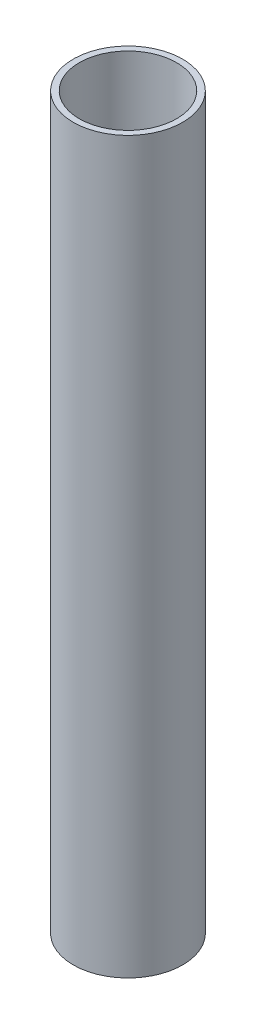
ISO-10303-21;
HEADER;
FILE_DESCRIPTION(('STEP AP214'),'2;1');
FILE_NAME('part.step','',(''),(''),'','','');
FILE_SCHEMA(('AUTOMOTIVE_DESIGN { 1 0 10303 214 1 1 1 1 }'));
ENDSEC;
DATA;
#1=APPLICATION_CONTEXT('core data for automotive mechanical design processes');
#2=APPLICATION_PROTOCOL_DEFINITION('international standard','automotive_design',2000,#1);
#3=PRODUCT_CONTEXT('',#1,'mechanical');
#4=PRODUCT('Part','Part','',(#3));
#5=PRODUCT_RELATED_PRODUCT_CATEGORY('part','',(#4));
#6=PRODUCT_DEFINITION_FORMATION('','',#4);
#7=PRODUCT_DEFINITION_CONTEXT('part definition',#1,'design');
#8=PRODUCT_DEFINITION('design','',#6,#7);
#9=PRODUCT_DEFINITION_SHAPE('','',#8);
#10=(LENGTH_UNIT() NAMED_UNIT(*) SI_UNIT(.MILLI.,.METRE.));
#11=(NAMED_UNIT(*) PLANE_ANGLE_UNIT() SI_UNIT($,.RADIAN.));
#12=(NAMED_UNIT(*) SI_UNIT($,.STERADIAN.) SOLID_ANGLE_UNIT());
#13=UNCERTAINTY_MEASURE_WITH_UNIT(LENGTH_MEASURE(1.E-05),#10,'distance_accuracy_value','');
#14=(GEOMETRIC_REPRESENTATION_CONTEXT(3) GLOBAL_UNCERTAINTY_ASSIGNED_CONTEXT((#13)) GLOBAL_UNIT_ASSIGNED_CONTEXT((#10,
#11,#12)) REPRESENTATION_CONTEXT('',''));
#15=CARTESIAN_POINT('',(0.,0.,0.));
#16=DIRECTION('',(0.,0.,1.));
#17=DIRECTION('',(1.,0.,0.));
#18=AXIS2_PLACEMENT_3D('',#15,#16,#17);
#19=CARTESIAN_POINT('',(0.,120.,0.));
#20=DIRECTION('',(0.,1.,0.));
#21=DIRECTION('',(0.,0.,1.));
#22=AXIS2_PLACEMENT_3D('',#19,#20,#21);
#23=PLANE('',#22);
#24=CARTESIAN_POINT('',(0.,120.,0.));
#25=DIRECTION('',(0.,1.,0.));
#26=DIRECTION('',(0.,0.,1.));
#27=AXIS2_PLACEMENT_3D('',#24,#25,#26);
#28=CIRCLE('',#27,9.);
#29=CARTESIAN_POINT('',(0.,120.,9.));
#30=VERTEX_POINT('',#29);
#31=EDGE_CURVE('E10',#30,#30,#28,.T.);
#32=ORIENTED_EDGE('',*,*,#31,.T.);
#33=EDGE_LOOP('',(#32));
#34=FACE_BOUND('',#33,.T.);
#35=CARTESIAN_POINT('',(0.,120.,0.));
#36=DIRECTION('',(0.,1.,0.));
#37=DIRECTION('',(0.,0.,1.));
#38=AXIS2_PLACEMENT_3D('',#35,#36,#37);
#39=CIRCLE('',#38,8.);
#40=CARTESIAN_POINT('',(0.,120.,8.));
#41=VERTEX_POINT('',#40);
#42=EDGE_CURVE('E47',#41,#41,#39,.T.);
#43=ORIENTED_EDGE('',*,*,#42,.F.);
#44=EDGE_LOOP('',(#43));
#45=FACE_BOUND('',#44,.T.);
#46=ADVANCED_FACE('F36',(#34,#45),#23,.T.);
#47=CARTESIAN_POINT('',(0.,0.,0.));
#48=DIRECTION('',(0.,1.,0.));
#49=DIRECTION('',(0.,0.,1.));
#50=AXIS2_PLACEMENT_3D('',#47,#48,#49);
#51=PLANE('',#50);
#52=CARTESIAN_POINT('',(0.,0.,0.));
#53=DIRECTION('',(0.,1.,0.));
#54=DIRECTION('',(0.,0.,1.));
#55=AXIS2_PLACEMENT_3D('',#52,#53,#54);
#56=CIRCLE('',#55,9.);
#57=CARTESIAN_POINT('',(0.,0.,9.));
#58=VERTEX_POINT('',#57);
#59=EDGE_CURVE('E40',#58,#58,#56,.T.);
#60=ORIENTED_EDGE('',*,*,#59,.F.);
#61=EDGE_LOOP('',(#60));
#62=FACE_BOUND('',#61,.T.);
#63=CARTESIAN_POINT('',(0.,0.,0.));
#64=DIRECTION('',(0.,1.,0.));
#65=DIRECTION('',(0.,0.,1.));
#66=AXIS2_PLACEMENT_3D('',#63,#64,#65);
#67=CIRCLE('',#66,8.);
#68=CARTESIAN_POINT('',(0.,0.,8.));
#69=VERTEX_POINT('',#68);
#70=EDGE_CURVE('E49',#69,#69,#67,.T.);
#71=ORIENTED_EDGE('',*,*,#70,.T.);
#72=EDGE_LOOP('',(#71));
#73=FACE_BOUND('',#72,.T.);
#74=ADVANCED_FACE('F59',(#62,#73),#51,.F.);
#75=CARTESIAN_POINT('',(0.,120.,0.));
#76=DIRECTION('',(0.,-1.,0.));
#77=DIRECTION('',(0.,0.,-1.));
#78=AXIS2_PLACEMENT_3D('',#75,#76,#77);
#79=CYLINDRICAL_SURFACE('',#78,9.);
#80=ORIENTED_EDGE('',*,*,#31,.F.);
#81=EDGE_LOOP('',(#80));
#82=FACE_BOUND('',#81,.T.);
#83=ORIENTED_EDGE('',*,*,#59,.T.);
#84=EDGE_LOOP('',(#83));
#85=FACE_BOUND('',#84,.T.);
#86=ADVANCED_FACE('F38',(#82,#85),#79,.T.);
#87=CARTESIAN_POINT('',(0.,120.,0.));
#88=DIRECTION('',(0.,-1.,0.));
#89=DIRECTION('',(0.,0.,-1.));
#90=AXIS2_PLACEMENT_3D('',#87,#88,#89);
#91=CYLINDRICAL_SURFACE('',#90,8.);
#92=ORIENTED_EDGE('',*,*,#42,.T.);
#93=EDGE_LOOP('',(#92));
#94=FACE_BOUND('',#93,.T.);
#95=ORIENTED_EDGE('',*,*,#70,.F.);
#96=EDGE_LOOP('',(#95));
#97=FACE_BOUND('',#96,.T.);
#98=ADVANCED_FACE('F55',(#94,#97),#91,.F.);
#99=CLOSED_SHELL('',(#46,#74,#86,#98));
#100=MANIFOLD_SOLID_BREP('B2',#99);
#101=ADVANCED_BREP_SHAPE_REPRESENTATION('',(#18,#100),#14);
#102=SHAPE_DEFINITION_REPRESENTATION(#9,#101);
ENDSEC;
END-ISO-10303-21;
